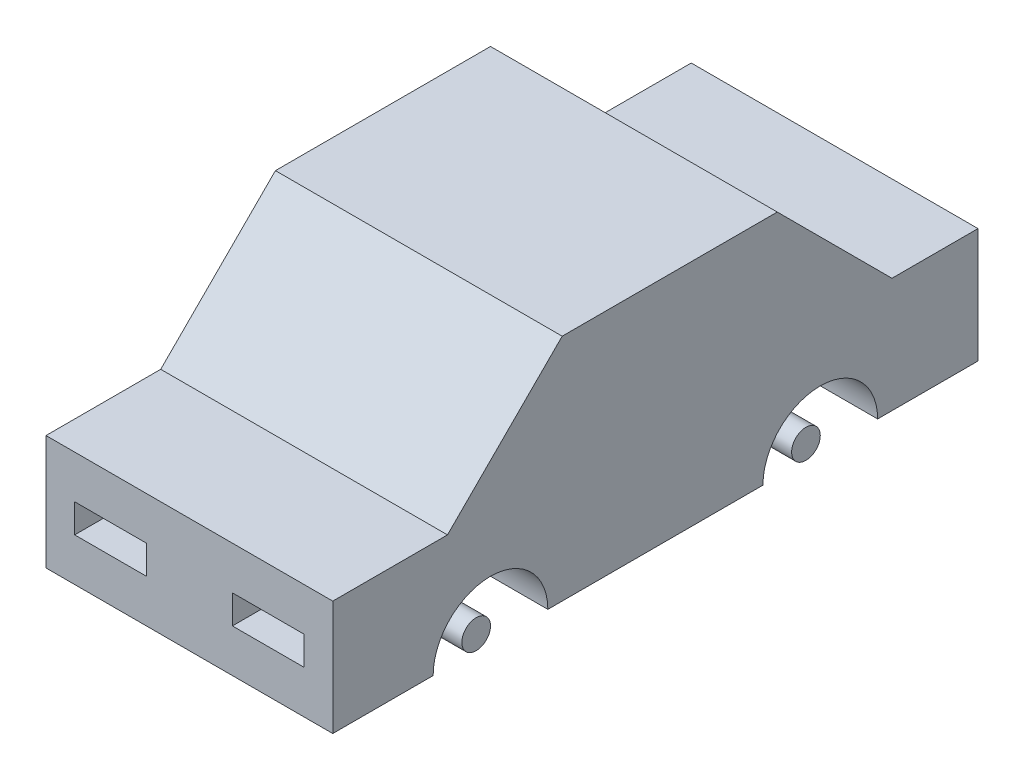
ISO-10303-21;
HEADER;
FILE_DESCRIPTION(('STEP AP214'),'2;1');
FILE_NAME('part.step','',(''),(''),'','','');
FILE_SCHEMA(('AUTOMOTIVE_DESIGN { 1 0 10303 214 1 1 1 1 }'));
ENDSEC;
DATA;
#1=APPLICATION_CONTEXT('core data for automotive mechanical design processes');
#2=APPLICATION_PROTOCOL_DEFINITION('international standard','automotive_design',2000,#1);
#3=PRODUCT_CONTEXT('',#1,'mechanical');
#4=PRODUCT('Part','Part','',(#3));
#5=PRODUCT_RELATED_PRODUCT_CATEGORY('part','',(#4));
#6=PRODUCT_DEFINITION_FORMATION('','',#4);
#7=PRODUCT_DEFINITION_CONTEXT('part definition',#1,'design');
#8=PRODUCT_DEFINITION('design','',#6,#7);
#9=PRODUCT_DEFINITION_SHAPE('','',#8);
#10=(LENGTH_UNIT() NAMED_UNIT(*) SI_UNIT(.MILLI.,.METRE.));
#11=(NAMED_UNIT(*) PLANE_ANGLE_UNIT() SI_UNIT($,.RADIAN.));
#12=(NAMED_UNIT(*) SI_UNIT($,.STERADIAN.) SOLID_ANGLE_UNIT());
#13=UNCERTAINTY_MEASURE_WITH_UNIT(LENGTH_MEASURE(1.E-05),#10,'distance_accuracy_value','');
#14=(GEOMETRIC_REPRESENTATION_CONTEXT(3) GLOBAL_UNCERTAINTY_ASSIGNED_CONTEXT((#13)) GLOBAL_UNIT_ASSIGNED_CONTEXT((#10,
#11,#12)) REPRESENTATION_CONTEXT('',''));
#15=CARTESIAN_POINT('',(0.,0.,0.));
#16=DIRECTION('',(0.,0.,1.));
#17=DIRECTION('',(1.,0.,0.));
#18=AXIS2_PLACEMENT_3D('',#15,#16,#17);
#19=CARTESIAN_POINT('',(1000.,0.,2250.));
#20=DIRECTION('',(0.,1.,0.));
#21=DIRECTION('',(0.,0.,1.));
#22=AXIS2_PLACEMENT_3D('',#19,#20,#21);
#23=PLANE('',#22);
#24=DIRECTION('',(-1.,0.,0.));
#25=VECTOR('',#24,1.);
#26=CARTESIAN_POINT('',(900.,0.,-1250.));
#27=LINE('',#26,#25);
#28=CARTESIAN_POINT('',(-600.,0.,-1250.));
#29=VERTEX_POINT('',#28);
#30=CARTESIAN_POINT('',(600.,0.,-1250.));
#31=VERTEX_POINT('',#30);
#32=EDGE_CURVE('E292',#29,#31,#27,.F.);
#33=ORIENTED_EDGE('',*,*,#32,.F.);
#34=DIRECTION('',(0.,0.,1.));
#35=VECTOR('',#34,1.);
#36=CARTESIAN_POINT('',(-600.,0.,-750.));
#37=LINE('',#36,#35);
#38=CARTESIAN_POINT('',(-600.,0.,-1550.));
#39=VERTEX_POINT('',#38);
#40=EDGE_CURVE('E315',#39,#29,#37,.T.);
#41=ORIENTED_EDGE('',*,*,#40,.F.);
#42=DIRECTION('',(-1.,0.,0.));
#43=VECTOR('',#42,1.);
#44=CARTESIAN_POINT('',(-600.,0.,-1550.));
#45=LINE('',#44,#43);
#46=CARTESIAN_POINT('',(-1000.,0.,-1550.));
#47=VERTEX_POINT('',#46);
#48=EDGE_CURVE('E318',#39,#47,#45,.T.);
#49=ORIENTED_EDGE('',*,*,#48,.T.);
#50=DIRECTION('',(0.,0.,-1.));
#51=VECTOR('',#50,1.);
#52=CARTESIAN_POINT('',(-1000.,0.,2250.));
#53=LINE('',#52,#51);
#54=CARTESIAN_POINT('',(-1000.,0.,-2250.));
#55=VERTEX_POINT('',#54);
#56=EDGE_CURVE('E351',#47,#55,#53,.T.);
#57=ORIENTED_EDGE('',*,*,#56,.T.);
#58=DIRECTION('',(-1.,0.,0.));
#59=VECTOR('',#58,1.);
#60=CARTESIAN_POINT('',(1000.,0.,-2250.));
#61=LINE('',#60,#59);
#62=CARTESIAN_POINT('',(1000.,0.,-2250.));
#63=VERTEX_POINT('',#62);
#64=EDGE_CURVE('E424',#63,#55,#61,.T.);
#65=ORIENTED_EDGE('',*,*,#64,.F.);
#66=DIRECTION('',(0.,0.,-1.));
#67=VECTOR('',#66,1.);
#68=CARTESIAN_POINT('',(1000.,0.,2250.));
#69=LINE('',#68,#67);
#70=CARTESIAN_POINT('',(1000.,0.,-1550.));
#71=VERTEX_POINT('',#70);
#72=EDGE_CURVE('E371',#71,#63,#69,.T.);
#73=ORIENTED_EDGE('',*,*,#72,.F.);
#74=DIRECTION('',(1.,0.,0.));
#75=VECTOR('',#74,1.);
#76=CARTESIAN_POINT('',(600.,0.,-1550.));
#77=LINE('',#76,#75);
#78=CARTESIAN_POINT('',(600.,0.,-1550.));
#79=VERTEX_POINT('',#78);
#80=EDGE_CURVE('E348',#79,#71,#77,.T.);
#81=ORIENTED_EDGE('',*,*,#80,.F.);
#82=DIRECTION('',(0.,0.,-1.));
#83=VECTOR('',#82,1.);
#84=CARTESIAN_POINT('',(600.,0.,-750.));
#85=LINE('',#84,#83);
#86=EDGE_CURVE('E357',#31,#79,#85,.T.);
#87=ORIENTED_EDGE('',*,*,#86,.F.);
#88=EDGE_LOOP('',(#33,#41,#49,#57,#65,#73,#81,#87));
#89=FACE_BOUND('',#88,.T.);
#90=ADVANCED_FACE('F32',(#89),#23,.F.);
#91=DIRECTION('',(-1.,0.,0.));
#92=VECTOR('',#91,1.);
#93=CARTESIAN_POINT('',(900.,0.,-1050.));
#94=LINE('',#93,#92);
#95=CARTESIAN_POINT('',(600.,0.,-1050.));
#96=VERTEX_POINT('',#95);
#97=CARTESIAN_POINT('',(-600.,0.,-1050.));
#98=VERTEX_POINT('',#97);
#99=EDGE_CURVE('E288',#96,#98,#94,.T.);
#100=ORIENTED_EDGE('',*,*,#99,.F.);
#101=CARTESIAN_POINT('',(600.,0.,-750.));
#102=VERTEX_POINT('',#101);
#103=EDGE_CURVE('E358',#102,#96,#85,.T.);
#104=ORIENTED_EDGE('',*,*,#103,.F.);
#105=DIRECTION('',(1.,0.,0.));
#106=VECTOR('',#105,1.);
#107=CARTESIAN_POINT('',(600.,0.,-750.));
#108=LINE('',#107,#106);
#109=CARTESIAN_POINT('',(1000.,0.,-750.));
#110=VERTEX_POINT('',#109);
#111=EDGE_CURVE('E361',#102,#110,#108,.T.);
#112=ORIENTED_EDGE('',*,*,#111,.T.);
#113=CARTESIAN_POINT('',(1000.,0.,750.));
#114=VERTEX_POINT('',#113);
#115=EDGE_CURVE('E370',#114,#110,#69,.T.);
#116=ORIENTED_EDGE('',*,*,#115,.F.);
#117=DIRECTION('',(1.,0.,0.));
#118=VECTOR('',#117,1.);
#119=CARTESIAN_POINT('',(600.,0.,750.));
#120=LINE('',#119,#118);
#121=CARTESIAN_POINT('',(600.,0.,750.));
#122=VERTEX_POINT('',#121);
#123=EDGE_CURVE('E349',#122,#114,#120,.T.);
#124=ORIENTED_EDGE('',*,*,#123,.F.);
#125=DIRECTION('',(0.,0.,-1.));
#126=VECTOR('',#125,1.);
#127=CARTESIAN_POINT('',(600.,0.,750.));
#128=LINE('',#127,#126);
#129=CARTESIAN_POINT('',(600.,0.,1050.));
#130=VERTEX_POINT('',#129);
#131=EDGE_CURVE('E341',#130,#122,#128,.T.);
#132=ORIENTED_EDGE('',*,*,#131,.F.);
#133=DIRECTION('',(-1.,0.,0.));
#134=VECTOR('',#133,1.);
#135=CARTESIAN_POINT('',(900.,0.,1050.));
#136=LINE('',#135,#134);
#137=CARTESIAN_POINT('',(-600.,0.,1050.));
#138=VERTEX_POINT('',#137);
#139=EDGE_CURVE('E305',#138,#130,#136,.F.);
#140=ORIENTED_EDGE('',*,*,#139,.F.);
#141=DIRECTION('',(0.,0.,1.));
#142=VECTOR('',#141,1.);
#143=CARTESIAN_POINT('',(-600.,0.,750.));
#144=LINE('',#143,#142);
#145=CARTESIAN_POINT('',(-600.,0.,750.));
#146=VERTEX_POINT('',#145);
#147=EDGE_CURVE('E330',#146,#138,#144,.T.);
#148=ORIENTED_EDGE('',*,*,#147,.F.);
#149=DIRECTION('',(-1.,0.,0.));
#150=VECTOR('',#149,1.);
#151=CARTESIAN_POINT('',(-600.,0.,750.));
#152=LINE('',#151,#150);
#153=CARTESIAN_POINT('',(-1000.,0.,750.));
#154=VERTEX_POINT('',#153);
#155=EDGE_CURVE('E333',#146,#154,#152,.T.);
#156=ORIENTED_EDGE('',*,*,#155,.T.);
#157=CARTESIAN_POINT('',(-1000.,0.,-750.));
#158=VERTEX_POINT('',#157);
#159=EDGE_CURVE('E390',#154,#158,#53,.T.);
#160=ORIENTED_EDGE('',*,*,#159,.T.);
#161=DIRECTION('',(-1.,0.,0.));
#162=VECTOR('',#161,1.);
#163=CARTESIAN_POINT('',(-600.,0.,-750.));
#164=LINE('',#163,#162);
#165=CARTESIAN_POINT('',(-600.,0.,-750.));
#166=VERTEX_POINT('',#165);
#167=EDGE_CURVE('E321',#166,#158,#164,.T.);
#168=ORIENTED_EDGE('',*,*,#167,.F.);
#169=EDGE_CURVE('E313',#98,#166,#37,.T.);
#170=ORIENTED_EDGE('',*,*,#169,.F.);
#171=EDGE_LOOP('',(#100,#104,#112,#116,#124,#132,#140,#148,#156,#160,#168,#170));
#172=FACE_BOUND('',#171,.T.);
#173=ADVANCED_FACE('F475',(#172),#23,.F.);
#174=DIRECTION('',(-1.,0.,0.));
#175=VECTOR('',#174,1.);
#176=CARTESIAN_POINT('',(900.,0.,1250.));
#177=LINE('',#176,#175);
#178=CARTESIAN_POINT('',(600.,0.,1250.));
#179=VERTEX_POINT('',#178);
#180=CARTESIAN_POINT('',(-600.,0.,1250.));
#181=VERTEX_POINT('',#180);
#182=EDGE_CURVE('E301',#179,#181,#177,.T.);
#183=ORIENTED_EDGE('',*,*,#182,.F.);
#184=CARTESIAN_POINT('',(600.,0.,1550.));
#185=VERTEX_POINT('',#184);
#186=EDGE_CURVE('E343',#185,#179,#128,.T.);
#187=ORIENTED_EDGE('',*,*,#186,.F.);
#188=DIRECTION('',(1.,0.,0.));
#189=VECTOR('',#188,1.);
#190=CARTESIAN_POINT('',(600.,0.,1550.));
#191=LINE('',#190,#189);
#192=CARTESIAN_POINT('',(1000.,0.,1550.));
#193=VERTEX_POINT('',#192);
#194=EDGE_CURVE('E346',#185,#193,#191,.T.);
#195=ORIENTED_EDGE('',*,*,#194,.T.);
#196=CARTESIAN_POINT('',(1000.,0.,2250.));
#197=VERTEX_POINT('',#196);
#198=EDGE_CURVE('E366',#197,#193,#69,.T.);
#199=ORIENTED_EDGE('',*,*,#198,.F.);
#200=DIRECTION('',(-1.,0.,0.));
#201=VECTOR('',#200,1.);
#202=CARTESIAN_POINT('',(1000.,0.,2250.));
#203=LINE('',#202,#201);
#204=CARTESIAN_POINT('',(-1000.,0.,2250.));
#205=VERTEX_POINT('',#204);
#206=EDGE_CURVE('E385',#197,#205,#203,.T.);
#207=ORIENTED_EDGE('',*,*,#206,.T.);
#208=CARTESIAN_POINT('',(-1000.,0.,1550.));
#209=VERTEX_POINT('',#208);
#210=EDGE_CURVE('E386',#205,#209,#53,.T.);
#211=ORIENTED_EDGE('',*,*,#210,.T.);
#212=DIRECTION('',(-1.,0.,0.));
#213=VECTOR('',#212,1.);
#214=CARTESIAN_POINT('',(-600.,0.,1550.));
#215=LINE('',#214,#213);
#216=CARTESIAN_POINT('',(-600.,0.,1550.));
#217=VERTEX_POINT('',#216);
#218=EDGE_CURVE('E320',#217,#209,#215,.T.);
#219=ORIENTED_EDGE('',*,*,#218,.F.);
#220=EDGE_CURVE('E329',#181,#217,#144,.T.);
#221=ORIENTED_EDGE('',*,*,#220,.F.);
#222=EDGE_LOOP('',(#183,#187,#195,#199,#207,#211,#219,#221));
#223=FACE_BOUND('',#222,.T.);
#224=ADVANCED_FACE('F437',(#223),#23,.F.);
#225=CARTESIAN_POINT('',(1000.,0.,-2250.));
#226=DIRECTION('',(0.,0.,1.));
#227=DIRECTION('',(1.,0.,0.));
#228=AXIS2_PLACEMENT_3D('',#225,#226,#227);
#229=PLANE('',#228);
#230=DIRECTION('',(0.,1.,0.));
#231=VECTOR('',#230,1.);
#232=CARTESIAN_POINT('',(-1000.,0.,-2250.));
#233=LINE('',#232,#231);
#234=CARTESIAN_POINT('',(-1000.,800.,-2250.));
#235=VERTEX_POINT('',#234);
#236=EDGE_CURVE('E389',#55,#235,#233,.T.);
#237=ORIENTED_EDGE('',*,*,#236,.T.);
#238=DIRECTION('',(-1.,0.,0.));
#239=VECTOR('',#238,1.);
#240=CARTESIAN_POINT('',(1000.,800.,-2250.));
#241=LINE('',#240,#239);
#242=CARTESIAN_POINT('',(1000.,800.,-2250.));
#243=VERTEX_POINT('',#242);
#244=EDGE_CURVE('E421',#243,#235,#241,.T.);
#245=ORIENTED_EDGE('',*,*,#244,.F.);
#246=DIRECTION('',(0.,1.,0.));
#247=VECTOR('',#246,1.);
#248=CARTESIAN_POINT('',(1000.,0.,-2250.));
#249=LINE('',#248,#247);
#250=EDGE_CURVE('E369',#63,#243,#249,.T.);
#251=ORIENTED_EDGE('',*,*,#250,.F.);
#252=ORIENTED_EDGE('',*,*,#64,.T.);
#253=EDGE_LOOP('',(#237,#245,#251,#252));
#254=FACE_BOUND('',#253,.T.);
#255=ADVANCED_FACE('F463',(#254),#229,.F.);
#256=CARTESIAN_POINT('',(1000.,800.,-2250.));
#257=DIRECTION('',(0.,-1.,0.));
#258=DIRECTION('',(0.,0.,-1.));
#259=AXIS2_PLACEMENT_3D('',#256,#257,#258);
#260=PLANE('',#259);
#261=DIRECTION('',(0.,0.,1.));
#262=VECTOR('',#261,1.);
#263=CARTESIAN_POINT('',(-1000.,800.,-2250.));
#264=LINE('',#263,#262);
#265=CARTESIAN_POINT('',(-1000.,800.,-1650.));
#266=VERTEX_POINT('',#265);
#267=EDGE_CURVE('E392',#235,#266,#264,.T.);
#268=ORIENTED_EDGE('',*,*,#267,.T.);
#269=DIRECTION('',(-1.,0.,0.));
#270=VECTOR('',#269,1.);
#271=CARTESIAN_POINT('',(1000.,800.,-1650.));
#272=LINE('',#271,#270);
#273=CARTESIAN_POINT('',(1000.,800.,-1650.));
#274=VERTEX_POINT('',#273);
#275=EDGE_CURVE('E418',#274,#266,#272,.T.);
#276=ORIENTED_EDGE('',*,*,#275,.F.);
#277=DIRECTION('',(0.,0.,1.));
#278=VECTOR('',#277,1.);
#279=CARTESIAN_POINT('',(1000.,800.,-2250.));
#280=LINE('',#279,#278);
#281=EDGE_CURVE('E373',#243,#274,#280,.T.);
#282=ORIENTED_EDGE('',*,*,#281,.F.);
#283=ORIENTED_EDGE('',*,*,#244,.T.);
#284=EDGE_LOOP('',(#268,#276,#282,#283));
#285=FACE_BOUND('',#284,.T.);
#286=ADVANCED_FACE('F521',(#285),#260,.F.);
#287=CARTESIAN_POINT('',(1000.,800.,-1650.));
#288=DIRECTION('',(0.,-0.707106781186547,0.707106781186548));
#289=DIRECTION('',(0.,-0.707106781186548,-0.707106781186547));
#290=AXIS2_PLACEMENT_3D('',#287,#288,#289);
#291=PLANE('',#290);
#292=DIRECTION('',(0.,0.707106781186548,0.707106781186547));
#293=VECTOR('',#292,1.);
#294=CARTESIAN_POINT('',(-1000.,800.,-1650.));
#295=LINE('',#294,#293);
#296=CARTESIAN_POINT('',(-1000.,1600.,-850.));
#297=VERTEX_POINT('',#296);
#298=EDGE_CURVE('E394',#266,#297,#295,.T.);
#299=ORIENTED_EDGE('',*,*,#298,.T.);
#300=DIRECTION('',(-1.,0.,0.));
#301=VECTOR('',#300,1.);
#302=CARTESIAN_POINT('',(1000.,1600.,-850.));
#303=LINE('',#302,#301);
#304=CARTESIAN_POINT('',(1000.,1600.,-850.));
#305=VERTEX_POINT('',#304);
#306=EDGE_CURVE('E415',#305,#297,#303,.T.);
#307=ORIENTED_EDGE('',*,*,#306,.F.);
#308=DIRECTION('',(0.,0.707106781186548,0.707106781186547));
#309=VECTOR('',#308,1.);
#310=CARTESIAN_POINT('',(1000.,800.,-1650.));
#311=LINE('',#310,#309);
#312=EDGE_CURVE('E375',#274,#305,#311,.T.);
#313=ORIENTED_EDGE('',*,*,#312,.F.);
#314=ORIENTED_EDGE('',*,*,#275,.T.);
#315=EDGE_LOOP('',(#299,#307,#313,#314));
#316=FACE_BOUND('',#315,.T.);
#317=ADVANCED_FACE('F525',(#316),#291,.F.);
#318=CARTESIAN_POINT('',(1000.,1600.,-850.));
#319=DIRECTION('',(0.,-1.,0.));
#320=DIRECTION('',(0.,0.,-1.));
#321=AXIS2_PLACEMENT_3D('',#318,#319,#320);
#322=PLANE('',#321);
#323=DIRECTION('',(0.,0.,1.));
#324=VECTOR('',#323,1.);
#325=CARTESIAN_POINT('',(-1000.,1600.,-850.));
#326=LINE('',#325,#324);
#327=CARTESIAN_POINT('',(-1000.,1600.,650.));
#328=VERTEX_POINT('',#327);
#329=EDGE_CURVE('E396',#297,#328,#326,.T.);
#330=ORIENTED_EDGE('',*,*,#329,.T.);
#331=DIRECTION('',(-1.,0.,0.));
#332=VECTOR('',#331,1.);
#333=CARTESIAN_POINT('',(1000.,1600.,650.));
#334=LINE('',#333,#332);
#335=CARTESIAN_POINT('',(1000.,1600.,650.));
#336=VERTEX_POINT('',#335);
#337=EDGE_CURVE('E412',#336,#328,#334,.T.);
#338=ORIENTED_EDGE('',*,*,#337,.F.);
#339=DIRECTION('',(0.,0.,1.));
#340=VECTOR('',#339,1.);
#341=CARTESIAN_POINT('',(1000.,1600.,-850.));
#342=LINE('',#341,#340);
#343=EDGE_CURVE('E377',#305,#336,#342,.T.);
#344=ORIENTED_EDGE('',*,*,#343,.F.);
#345=ORIENTED_EDGE('',*,*,#306,.T.);
#346=EDGE_LOOP('',(#330,#338,#344,#345));
#347=FACE_BOUND('',#346,.T.);
#348=ADVANCED_FACE('F531',(#347),#322,.F.);
#349=CARTESIAN_POINT('',(1000.,1600.,650.));
#350=DIRECTION('',(0.,-0.707106781186548,-0.707106781186547));
#351=DIRECTION('',(0.,0.707106781186547,-0.707106781186548));
#352=AXIS2_PLACEMENT_3D('',#349,#350,#351);
#353=PLANE('',#352);
#354=DIRECTION('',(0.,-0.707106781186547,0.707106781186548));
#355=VECTOR('',#354,1.);
#356=CARTESIAN_POINT('',(-1000.,1600.,650.));
#357=LINE('',#356,#355);
#358=CARTESIAN_POINT('',(-1000.,800.,1450.));
#359=VERTEX_POINT('',#358);
#360=EDGE_CURVE('E398',#328,#359,#357,.T.);
#361=ORIENTED_EDGE('',*,*,#360,.T.);
#362=DIRECTION('',(-1.,0.,0.));
#363=VECTOR('',#362,1.);
#364=CARTESIAN_POINT('',(1000.,800.,1450.));
#365=LINE('',#364,#363);
#366=CARTESIAN_POINT('',(1000.,800.,1450.));
#367=VERTEX_POINT('',#366);
#368=EDGE_CURVE('E409',#367,#359,#365,.T.);
#369=ORIENTED_EDGE('',*,*,#368,.F.);
#370=DIRECTION('',(0.,-0.707106781186547,0.707106781186548));
#371=VECTOR('',#370,1.);
#372=CARTESIAN_POINT('',(1000.,1600.,650.));
#373=LINE('',#372,#371);
#374=EDGE_CURVE('E379',#336,#367,#373,.T.);
#375=ORIENTED_EDGE('',*,*,#374,.F.);
#376=ORIENTED_EDGE('',*,*,#337,.T.);
#377=EDGE_LOOP('',(#361,#369,#375,#376));
#378=FACE_BOUND('',#377,.T.);
#379=ADVANCED_FACE('F535',(#378),#353,.F.);
#380=CARTESIAN_POINT('',(1000.,800.,1450.));
#381=DIRECTION('',(0.,-1.,0.));
#382=DIRECTION('',(0.,0.,-1.));
#383=AXIS2_PLACEMENT_3D('',#380,#381,#382);
#384=PLANE('',#383);
#385=DIRECTION('',(0.,0.,1.));
#386=VECTOR('',#385,1.);
#387=CARTESIAN_POINT('',(-1000.,800.,1450.));
#388=LINE('',#387,#386);
#389=CARTESIAN_POINT('',(-1000.,800.,2250.));
#390=VERTEX_POINT('',#389);
#391=EDGE_CURVE('E400',#359,#390,#388,.T.);
#392=ORIENTED_EDGE('',*,*,#391,.T.);
#393=DIRECTION('',(-1.,0.,0.));
#394=VECTOR('',#393,1.);
#395=CARTESIAN_POINT('',(1000.,800.,2250.));
#396=LINE('',#395,#394);
#397=CARTESIAN_POINT('',(1000.,800.,2250.));
#398=VERTEX_POINT('',#397);
#399=EDGE_CURVE('E406',#398,#390,#396,.T.);
#400=ORIENTED_EDGE('',*,*,#399,.F.);
#401=DIRECTION('',(0.,0.,1.));
#402=VECTOR('',#401,1.);
#403=CARTESIAN_POINT('',(1000.,800.,1450.));
#404=LINE('',#403,#402);
#405=EDGE_CURVE('E381',#367,#398,#404,.T.);
#406=ORIENTED_EDGE('',*,*,#405,.F.);
#407=ORIENTED_EDGE('',*,*,#368,.T.);
#408=EDGE_LOOP('',(#392,#400,#406,#407));
#409=FACE_BOUND('',#408,.T.);
#410=ADVANCED_FACE('F539',(#409),#384,.F.);
#411=CARTESIAN_POINT('',(1000.,800.,2250.));
#412=DIRECTION('',(0.,0.,-1.));
#413=DIRECTION('',(-1.,0.,0.));
#414=AXIS2_PLACEMENT_3D('',#411,#412,#413);
#415=PLANE('',#414);
#416=DIRECTION('',(1.,0.,0.));
#417=VECTOR('',#416,1.);
#418=CARTESIAN_POINT('',(-800.,300.,2250.));
#419=LINE('',#418,#417);
#420=CARTESIAN_POINT('',(-800.,300.,2250.));
#421=VERTEX_POINT('',#420);
#422=CARTESIAN_POINT('',(-300.,300.,2250.));
#423=VERTEX_POINT('',#422);
#424=EDGE_CURVE('E245',#421,#423,#419,.T.);
#425=ORIENTED_EDGE('',*,*,#424,.F.);
#426=DIRECTION('',(0.,-1.,0.));
#427=VECTOR('',#426,1.);
#428=CARTESIAN_POINT('',(-800.,500.,2250.));
#429=LINE('',#428,#427);
#430=CARTESIAN_POINT('',(-800.,500.,2250.));
#431=VERTEX_POINT('',#430);
#432=EDGE_CURVE('E46',#431,#421,#429,.T.);
#433=ORIENTED_EDGE('',*,*,#432,.F.);
#434=DIRECTION('',(-1.,0.,0.));
#435=VECTOR('',#434,1.);
#436=CARTESIAN_POINT('',(-800.,500.,2250.));
#437=LINE('',#436,#435);
#438=CARTESIAN_POINT('',(-300.,500.,2250.));
#439=VERTEX_POINT('',#438);
#440=EDGE_CURVE('E236',#439,#431,#437,.T.);
#441=ORIENTED_EDGE('',*,*,#440,.F.);
#442=DIRECTION('',(0.,1.,0.));
#443=VECTOR('',#442,1.);
#444=CARTESIAN_POINT('',(-300.,500.,2250.));
#445=LINE('',#444,#443);
#446=EDGE_CURVE('E239',#423,#439,#445,.T.);
#447=ORIENTED_EDGE('',*,*,#446,.F.);
#448=EDGE_LOOP('',(#425,#433,#441,#447));
#449=FACE_BOUND('',#448,.T.);
#450=DIRECTION('',(-1.,0.,0.));
#451=VECTOR('',#450,1.);
#452=CARTESIAN_POINT('',(800.,500.,2250.));
#453=LINE('',#452,#451);
#454=CARTESIAN_POINT('',(800.,500.,2250.));
#455=VERTEX_POINT('',#454);
#456=CARTESIAN_POINT('',(300.,500.,2250.));
#457=VERTEX_POINT('',#456);
#458=EDGE_CURVE('E271',#455,#457,#453,.T.);
#459=ORIENTED_EDGE('',*,*,#458,.F.);
#460=DIRECTION('',(0.,1.,0.));
#461=VECTOR('',#460,1.);
#462=CARTESIAN_POINT('',(800.,500.,2250.));
#463=LINE('',#462,#461);
#464=CARTESIAN_POINT('',(800.,300.,2250.));
#465=VERTEX_POINT('',#464);
#466=EDGE_CURVE('E54',#465,#455,#463,.T.);
#467=ORIENTED_EDGE('',*,*,#466,.F.);
#468=DIRECTION('',(1.,0.,0.));
#469=VECTOR('',#468,1.);
#470=CARTESIAN_POINT('',(800.,300.,2250.));
#471=LINE('',#470,#469);
#472=CARTESIAN_POINT('',(300.,300.,2250.));
#473=VERTEX_POINT('',#472);
#474=EDGE_CURVE('E260',#473,#465,#471,.T.);
#475=ORIENTED_EDGE('',*,*,#474,.F.);
#476=DIRECTION('',(0.,-1.,0.));
#477=VECTOR('',#476,1.);
#478=CARTESIAN_POINT('',(300.,500.,2250.));
#479=LINE('',#478,#477);
#480=EDGE_CURVE('E274',#457,#473,#479,.T.);
#481=ORIENTED_EDGE('',*,*,#480,.F.);
#482=EDGE_LOOP('',(#459,#467,#475,#481));
#483=FACE_BOUND('',#482,.T.);
#484=DIRECTION('',(0.,-1.,0.));
#485=VECTOR('',#484,1.);
#486=CARTESIAN_POINT('',(-1000.,800.,2250.));
#487=LINE('',#486,#485);
#488=EDGE_CURVE('E402',#390,#205,#487,.T.);
#489=ORIENTED_EDGE('',*,*,#488,.T.);
#490=ORIENTED_EDGE('',*,*,#206,.F.);
#491=DIRECTION('',(0.,-1.,0.));
#492=VECTOR('',#491,1.);
#493=CARTESIAN_POINT('',(1000.,800.,2250.));
#494=LINE('',#493,#492);
#495=EDGE_CURVE('E383',#398,#197,#494,.T.);
#496=ORIENTED_EDGE('',*,*,#495,.F.);
#497=ORIENTED_EDGE('',*,*,#399,.T.);
#498=EDGE_LOOP('',(#489,#490,#496,#497));
#499=FACE_BOUND('',#498,.T.);
#500=ADVANCED_FACE('F543',(#449,#483,#499),#415,.F.);
#501=CARTESIAN_POINT('',(1000.,0.,0.));
#502=DIRECTION('',(1.,0.,0.));
#503=DIRECTION('',(0.,0.,-1.));
#504=AXIS2_PLACEMENT_3D('',#501,#502,#503);
#505=PLANE('',#504);
#506=CARTESIAN_POINT('',(1000.,0.,1150.));
#507=DIRECTION('',(1.,0.,0.));
#508=DIRECTION('',(0.,0.,1.));
#509=AXIS2_PLACEMENT_3D('',#506,#507,#508);
#510=CIRCLE('',#509,400.);
#511=EDGE_CURVE('E342',#114,#193,#510,.T.);
#512=ORIENTED_EDGE('',*,*,#511,.F.);
#513=ORIENTED_EDGE('',*,*,#115,.T.);
#514=CARTESIAN_POINT('',(1000.,0.,-1150.));
#515=DIRECTION('',(1.,0.,0.));
#516=DIRECTION('',(0.,0.,-1.));
#517=AXIS2_PLACEMENT_3D('',#514,#515,#516);
#518=CIRCLE('',#517,400.);
#519=EDGE_CURVE('E323',#71,#110,#518,.T.);
#520=ORIENTED_EDGE('',*,*,#519,.F.);
#521=ORIENTED_EDGE('',*,*,#72,.T.);
#522=ORIENTED_EDGE('',*,*,#250,.T.);
#523=ORIENTED_EDGE('',*,*,#281,.T.);
#524=ORIENTED_EDGE('',*,*,#312,.T.);
#525=ORIENTED_EDGE('',*,*,#343,.T.);
#526=ORIENTED_EDGE('',*,*,#374,.T.);
#527=ORIENTED_EDGE('',*,*,#405,.T.);
#528=ORIENTED_EDGE('',*,*,#495,.T.);
#529=ORIENTED_EDGE('',*,*,#198,.T.);
#530=EDGE_LOOP('',(#512,#513,#520,#521,#522,#523,#524,#525,#526,#527,#528,#529));
#531=FACE_BOUND('',#530,.T.);
#532=ADVANCED_FACE('F467',(#531),#505,.T.);
#533=CARTESIAN_POINT('',(-1000.,0.,0.));
#534=DIRECTION('',(1.,0.,0.));
#535=DIRECTION('',(0.,0.,-1.));
#536=AXIS2_PLACEMENT_3D('',#533,#534,#535);
#537=PLANE('',#536);
#538=ORIENTED_EDGE('',*,*,#56,.F.);
#539=CARTESIAN_POINT('',(-1000.,0.,-1150.));
#540=DIRECTION('',(-1.,0.,0.));
#541=DIRECTION('',(0.,0.,1.));
#542=AXIS2_PLACEMENT_3D('',#539,#540,#541);
#543=CIRCLE('',#542,400.);
#544=EDGE_CURVE('E314',#158,#47,#543,.T.);
#545=ORIENTED_EDGE('',*,*,#544,.F.);
#546=ORIENTED_EDGE('',*,*,#159,.F.);
#547=CARTESIAN_POINT('',(-1000.,0.,1150.));
#548=DIRECTION('',(-1.,0.,0.));
#549=DIRECTION('',(0.,0.,1.));
#550=AXIS2_PLACEMENT_3D('',#547,#548,#549);
#551=CIRCLE('',#550,400.);
#552=EDGE_CURVE('E309',#209,#154,#551,.T.);
#553=ORIENTED_EDGE('',*,*,#552,.F.);
#554=ORIENTED_EDGE('',*,*,#210,.F.);
#555=ORIENTED_EDGE('',*,*,#488,.F.);
#556=ORIENTED_EDGE('',*,*,#391,.F.);
#557=ORIENTED_EDGE('',*,*,#360,.F.);
#558=ORIENTED_EDGE('',*,*,#329,.F.);
#559=ORIENTED_EDGE('',*,*,#298,.F.);
#560=ORIENTED_EDGE('',*,*,#267,.F.);
#561=ORIENTED_EDGE('',*,*,#236,.F.);
#562=EDGE_LOOP('',(#538,#545,#546,#553,#554,#555,#556,#557,#558,#559,#560,#561));
#563=FACE_BOUND('',#562,.T.);
#564=ADVANCED_FACE('F446',(#563),#537,.F.);
#565=CARTESIAN_POINT('',(600.,0.,-1150.));
#566=DIRECTION('',(1.,0.,0.));
#567=DIRECTION('',(0.,0.,-1.));
#568=AXIS2_PLACEMENT_3D('',#565,#566,#567);
#569=CYLINDRICAL_SURFACE('',#568,400.);
#570=ORIENTED_EDGE('',*,*,#519,.T.);
#571=ORIENTED_EDGE('',*,*,#111,.F.);
#572=CARTESIAN_POINT('',(600.,0.,-1150.));
#573=DIRECTION('',(1.,0.,0.));
#574=DIRECTION('',(0.,0.,-1.));
#575=AXIS2_PLACEMENT_3D('',#572,#573,#574);
#576=CIRCLE('',#575,400.);
#577=EDGE_CURVE('E354',#79,#102,#576,.T.);
#578=ORIENTED_EDGE('',*,*,#577,.F.);
#579=ORIENTED_EDGE('',*,*,#80,.T.);
#580=EDGE_LOOP('',(#570,#571,#578,#579));
#581=FACE_BOUND('',#580,.T.);
#582=ADVANCED_FACE('F480',(#581),#569,.F.);
#583=CARTESIAN_POINT('',(600.,0.,-1150.));
#584=DIRECTION('',(1.,0.,0.));
#585=DIRECTION('',(0.,0.,-1.));
#586=AXIS2_PLACEMENT_3D('',#583,#584,#585);
#587=PLANE('',#586);
#588=ORIENTED_EDGE('',*,*,#103,.T.);
#589=CARTESIAN_POINT('',(600.,0.,-1150.));
#590=DIRECTION('',(1.,0.,0.));
#591=DIRECTION('',(0.,0.,-1.));
#592=AXIS2_PLACEMENT_3D('',#589,#590,#591);
#593=CIRCLE('',#592,100.);
#594=EDGE_CURVE('E294',#96,#31,#593,.F.);
#595=ORIENTED_EDGE('',*,*,#594,.T.);
#596=ORIENTED_EDGE('',*,*,#86,.T.);
#597=ORIENTED_EDGE('',*,*,#577,.T.);
#598=EDGE_LOOP('',(#588,#595,#596,#597));
#599=FACE_BOUND('',#598,.T.);
#600=ADVANCED_FACE('F482',(#599),#587,.T.);
#601=CARTESIAN_POINT('',(600.,0.,1150.));
#602=DIRECTION('',(1.,0.,0.));
#603=DIRECTION('',(0.,0.,-1.));
#604=AXIS2_PLACEMENT_3D('',#601,#602,#603);
#605=CYLINDRICAL_SURFACE('',#604,400.);
#606=ORIENTED_EDGE('',*,*,#511,.T.);
#607=ORIENTED_EDGE('',*,*,#194,.F.);
#608=CARTESIAN_POINT('',(600.,0.,1150.));
#609=DIRECTION('',(1.,0.,0.));
#610=DIRECTION('',(0.,0.,1.));
#611=AXIS2_PLACEMENT_3D('',#608,#609,#610);
#612=CIRCLE('',#611,400.);
#613=EDGE_CURVE('E338',#122,#185,#612,.T.);
#614=ORIENTED_EDGE('',*,*,#613,.F.);
#615=ORIENTED_EDGE('',*,*,#123,.T.);
#616=EDGE_LOOP('',(#606,#607,#614,#615));
#617=FACE_BOUND('',#616,.T.);
#618=ADVANCED_FACE('F556',(#617),#605,.F.);
#619=CARTESIAN_POINT('',(600.,0.,1150.));
#620=DIRECTION('',(-1.,0.,0.));
#621=DIRECTION('',(0.,0.,1.));
#622=AXIS2_PLACEMENT_3D('',#619,#620,#621);
#623=PLANE('',#622);
#624=CARTESIAN_POINT('',(600.,0.,1150.));
#625=DIRECTION('',(-1.,0.,0.));
#626=DIRECTION('',(0.,0.,1.));
#627=AXIS2_PLACEMENT_3D('',#624,#625,#626);
#628=CIRCLE('',#627,100.);
#629=EDGE_CURVE('E307',#130,#179,#628,.F.);
#630=ORIENTED_EDGE('',*,*,#629,.F.);
#631=ORIENTED_EDGE('',*,*,#131,.T.);
#632=ORIENTED_EDGE('',*,*,#613,.T.);
#633=ORIENTED_EDGE('',*,*,#186,.T.);
#634=EDGE_LOOP('',(#630,#631,#632,#633));
#635=FACE_BOUND('',#634,.T.);
#636=ADVANCED_FACE('F559',(#635),#623,.F.);
#637=CARTESIAN_POINT('',(-600.,0.,1150.));
#638=DIRECTION('',(-1.,0.,0.));
#639=DIRECTION('',(0.,0.,1.));
#640=AXIS2_PLACEMENT_3D('',#637,#638,#639);
#641=CYLINDRICAL_SURFACE('',#640,400.);
#642=ORIENTED_EDGE('',*,*,#552,.T.);
#643=ORIENTED_EDGE('',*,*,#155,.F.);
#644=CARTESIAN_POINT('',(-600.,0.,1150.));
#645=DIRECTION('',(-1.,0.,0.));
#646=DIRECTION('',(0.,0.,1.));
#647=AXIS2_PLACEMENT_3D('',#644,#645,#646);
#648=CIRCLE('',#647,400.);
#649=EDGE_CURVE('E326',#217,#146,#648,.T.);
#650=ORIENTED_EDGE('',*,*,#649,.F.);
#651=ORIENTED_EDGE('',*,*,#218,.T.);
#652=EDGE_LOOP('',(#642,#643,#650,#651));
#653=FACE_BOUND('',#652,.T.);
#654=ADVANCED_FACE('F442',(#653),#641,.F.);
#655=CARTESIAN_POINT('',(-600.,0.,1150.));
#656=DIRECTION('',(-1.,0.,0.));
#657=DIRECTION('',(0.,0.,1.));
#658=AXIS2_PLACEMENT_3D('',#655,#656,#657);
#659=PLANE('',#658);
#660=ORIENTED_EDGE('',*,*,#147,.T.);
#661=CARTESIAN_POINT('',(-600.,0.,1150.));
#662=DIRECTION('',(-1.,0.,0.));
#663=DIRECTION('',(0.,0.,1.));
#664=AXIS2_PLACEMENT_3D('',#661,#662,#663);
#665=CIRCLE('',#664,100.);
#666=EDGE_CURVE('E39',#138,#181,#665,.F.);
#667=ORIENTED_EDGE('',*,*,#666,.T.);
#668=ORIENTED_EDGE('',*,*,#220,.T.);
#669=ORIENTED_EDGE('',*,*,#649,.T.);
#670=EDGE_LOOP('',(#660,#667,#668,#669));
#671=FACE_BOUND('',#670,.T.);
#672=ADVANCED_FACE('F429',(#671),#659,.T.);
#673=CARTESIAN_POINT('',(-600.,0.,-1150.));
#674=DIRECTION('',(-1.,0.,0.));
#675=DIRECTION('',(0.,0.,1.));
#676=AXIS2_PLACEMENT_3D('',#673,#674,#675);
#677=CYLINDRICAL_SURFACE('',#676,400.);
#678=ORIENTED_EDGE('',*,*,#544,.T.);
#679=ORIENTED_EDGE('',*,*,#48,.F.);
#680=CARTESIAN_POINT('',(-600.,0.,-1150.));
#681=DIRECTION('',(-1.,0.,0.));
#682=DIRECTION('',(0.,0.,1.));
#683=AXIS2_PLACEMENT_3D('',#680,#681,#682);
#684=CIRCLE('',#683,400.);
#685=EDGE_CURVE('E310',#166,#39,#684,.T.);
#686=ORIENTED_EDGE('',*,*,#685,.F.);
#687=ORIENTED_EDGE('',*,*,#167,.T.);
#688=EDGE_LOOP('',(#678,#679,#686,#687));
#689=FACE_BOUND('',#688,.T.);
#690=ADVANCED_FACE('F490',(#689),#677,.F.);
#691=CARTESIAN_POINT('',(-600.,0.,-1150.));
#692=DIRECTION('',(-1.,0.,0.));
#693=DIRECTION('',(0.,0.,1.));
#694=AXIS2_PLACEMENT_3D('',#691,#692,#693);
#695=PLANE('',#694);
#696=ORIENTED_EDGE('',*,*,#40,.T.);
#697=CARTESIAN_POINT('',(-600.,0.,-1150.));
#698=DIRECTION('',(-1.,0.,0.));
#699=DIRECTION('',(0.,0.,1.));
#700=AXIS2_PLACEMENT_3D('',#697,#698,#699);
#701=CIRCLE('',#700,100.);
#702=EDGE_CURVE('E11',#29,#98,#701,.F.);
#703=ORIENTED_EDGE('',*,*,#702,.T.);
#704=ORIENTED_EDGE('',*,*,#169,.T.);
#705=ORIENTED_EDGE('',*,*,#685,.T.);
#706=EDGE_LOOP('',(#696,#703,#704,#705));
#707=FACE_BOUND('',#706,.T.);
#708=ADVANCED_FACE('F486',(#707),#695,.T.);
#709=CARTESIAN_POINT('',(900.,0.,1150.));
#710=DIRECTION('',(-1.,0.,0.));
#711=DIRECTION('',(0.,0.,1.));
#712=AXIS2_PLACEMENT_3D('',#709,#710,#711);
#713=CYLINDRICAL_SURFACE('',#712,100.);
#714=CARTESIAN_POINT('',(900.,0.,1150.));
#715=DIRECTION('',(1.,0.,0.));
#716=DIRECTION('',(0.,0.,-1.));
#717=AXIS2_PLACEMENT_3D('',#714,#715,#716);
#718=CIRCLE('',#717,100.);
#719=CARTESIAN_POINT('',(900.,0.,1050.));
#720=VERTEX_POINT('',#719);
#721=EDGE_CURVE('E298',#720,#720,#718,.T.);
#722=ORIENTED_EDGE('',*,*,#721,.F.);
#723=EDGE_LOOP('',(#722));
#724=FACE_BOUND('',#723,.T.);
#725=CARTESIAN_POINT('',(-900.,0.,1150.));
#726=DIRECTION('',(1.,0.,0.));
#727=DIRECTION('',(0.,0.,-1.));
#728=AXIS2_PLACEMENT_3D('',#725,#726,#727);
#729=CIRCLE('',#728,100.);
#730=CARTESIAN_POINT('',(-900.,0.,1050.));
#731=VERTEX_POINT('',#730);
#732=EDGE_CURVE('E297',#731,#731,#729,.T.);
#733=ORIENTED_EDGE('',*,*,#732,.T.);
#734=EDGE_LOOP('',(#733));
#735=FACE_BOUND('',#734,.T.);
#736=ORIENTED_EDGE('',*,*,#139,.T.);
#737=ORIENTED_EDGE('',*,*,#629,.T.);
#738=ORIENTED_EDGE('',*,*,#182,.T.);
#739=ORIENTED_EDGE('',*,*,#666,.F.);
#740=EDGE_LOOP('',(#736,#737,#738,#739));
#741=FACE_BOUND('',#740,.T.);
#742=ADVANCED_FACE('F572',(#724,#735,#741),#713,.T.);
#743=CARTESIAN_POINT('',(900.,0.,1150.));
#744=DIRECTION('',(1.,0.,0.));
#745=DIRECTION('',(0.,0.,-1.));
#746=AXIS2_PLACEMENT_3D('',#743,#744,#745);
#747=PLANE('',#746);
#748=ORIENTED_EDGE('',*,*,#721,.T.);
#749=EDGE_LOOP('',(#748));
#750=FACE_BOUND('',#749,.T.);
#751=ADVANCED_FACE('F575',(#750),#747,.T.);
#752=CARTESIAN_POINT('',(-900.,0.,1150.));
#753=DIRECTION('',(1.,0.,0.));
#754=DIRECTION('',(0.,0.,-1.));
#755=AXIS2_PLACEMENT_3D('',#752,#753,#754);
#756=PLANE('',#755);
#757=ORIENTED_EDGE('',*,*,#732,.F.);
#758=EDGE_LOOP('',(#757));
#759=FACE_BOUND('',#758,.T.);
#760=ADVANCED_FACE('F495',(#759),#756,.F.);
#761=CARTESIAN_POINT('',(900.,0.,-1150.));
#762=DIRECTION('',(-1.,0.,0.));
#763=DIRECTION('',(0.,0.,1.));
#764=AXIS2_PLACEMENT_3D('',#761,#762,#763);
#765=CYLINDRICAL_SURFACE('',#764,100.);
#766=ORIENTED_EDGE('',*,*,#594,.F.);
#767=ORIENTED_EDGE('',*,*,#99,.T.);
#768=ORIENTED_EDGE('',*,*,#702,.F.);
#769=ORIENTED_EDGE('',*,*,#32,.T.);
#770=EDGE_LOOP('',(#766,#767,#768,#769));
#771=FACE_BOUND('',#770,.T.);
#772=CARTESIAN_POINT('',(900.,0.,-1150.));
#773=DIRECTION('',(1.,0.,0.));
#774=DIRECTION('',(0.,0.,-1.));
#775=AXIS2_PLACEMENT_3D('',#772,#773,#774);
#776=CIRCLE('',#775,100.);
#777=CARTESIAN_POINT('',(900.,0.,-1250.));
#778=VERTEX_POINT('',#777);
#779=EDGE_CURVE('E285',#778,#778,#776,.T.);
#780=ORIENTED_EDGE('',*,*,#779,.F.);
#781=EDGE_LOOP('',(#780));
#782=FACE_BOUND('',#781,.T.);
#783=CARTESIAN_POINT('',(-900.,0.,-1150.));
#784=DIRECTION('',(1.,0.,0.));
#785=DIRECTION('',(0.,0.,-1.));
#786=AXIS2_PLACEMENT_3D('',#783,#784,#785);
#787=CIRCLE('',#786,100.);
#788=CARTESIAN_POINT('',(-900.,0.,-1250.));
#789=VERTEX_POINT('',#788);
#790=EDGE_CURVE('E252',#789,#789,#787,.T.);
#791=ORIENTED_EDGE('',*,*,#790,.T.);
#792=EDGE_LOOP('',(#791));
#793=FACE_BOUND('',#792,.T.);
#794=ADVANCED_FACE('F491',(#771,#782,#793),#765,.T.);
#795=CARTESIAN_POINT('',(900.,0.,-1150.));
#796=DIRECTION('',(1.,0.,0.));
#797=DIRECTION('',(0.,0.,-1.));
#798=AXIS2_PLACEMENT_3D('',#795,#796,#797);
#799=PLANE('',#798);
#800=ORIENTED_EDGE('',*,*,#779,.T.);
#801=EDGE_LOOP('',(#800));
#802=FACE_BOUND('',#801,.T.);
#803=ADVANCED_FACE('F494',(#802),#799,.T.);
#804=CARTESIAN_POINT('',(-900.,0.,-1150.));
#805=DIRECTION('',(1.,0.,0.));
#806=DIRECTION('',(0.,0.,-1.));
#807=AXIS2_PLACEMENT_3D('',#804,#805,#806);
#808=PLANE('',#807);
#809=ORIENTED_EDGE('',*,*,#790,.F.);
#810=EDGE_LOOP('',(#809));
#811=FACE_BOUND('',#810,.T.);
#812=ADVANCED_FACE('F501',(#811),#808,.F.);
#813=CARTESIAN_POINT('',(800.,500.,1950.));
#814=DIRECTION('',(1.,0.,0.));
#815=DIRECTION('',(0.,0.,-1.));
#816=AXIS2_PLACEMENT_3D('',#813,#814,#815);
#817=PLANE('',#816);
#818=ORIENTED_EDGE('',*,*,#466,.T.);
#819=DIRECTION('',(0.,0.,1.));
#820=VECTOR('',#819,1.);
#821=CARTESIAN_POINT('',(800.,500.,1950.));
#822=LINE('',#821,#820);
#823=CARTESIAN_POINT('',(800.,500.,1950.));
#824=VERTEX_POINT('',#823);
#825=EDGE_CURVE('E269',#824,#455,#822,.T.);
#826=ORIENTED_EDGE('',*,*,#825,.F.);
#827=DIRECTION('',(0.,1.,0.));
#828=VECTOR('',#827,1.);
#829=CARTESIAN_POINT('',(800.,500.,1950.));
#830=LINE('',#829,#828);
#831=CARTESIAN_POINT('',(800.,300.,1950.));
#832=VERTEX_POINT('',#831);
#833=EDGE_CURVE('E256',#832,#824,#830,.T.);
#834=ORIENTED_EDGE('',*,*,#833,.F.);
#835=DIRECTION('',(0.,0.,1.));
#836=VECTOR('',#835,1.);
#837=CARTESIAN_POINT('',(800.,300.,1950.));
#838=LINE('',#837,#836);
#839=EDGE_CURVE('E246',#832,#465,#838,.T.);
#840=ORIENTED_EDGE('',*,*,#839,.T.);
#841=EDGE_LOOP('',(#818,#826,#834,#840));
#842=FACE_BOUND('',#841,.T.);
#843=ADVANCED_FACE('F503',(#842),#817,.F.);
#844=CARTESIAN_POINT('',(800.,300.,1950.));
#845=DIRECTION('',(0.,-1.,0.));
#846=DIRECTION('',(0.,0.,-1.));
#847=AXIS2_PLACEMENT_3D('',#844,#845,#846);
#848=PLANE('',#847);
#849=ORIENTED_EDGE('',*,*,#474,.T.);
#850=ORIENTED_EDGE('',*,*,#839,.F.);
#851=DIRECTION('',(1.,0.,0.));
#852=VECTOR('',#851,1.);
#853=CARTESIAN_POINT('',(800.,300.,1950.));
#854=LINE('',#853,#852);
#855=CARTESIAN_POINT('',(300.,300.,1950.));
#856=VERTEX_POINT('',#855);
#857=EDGE_CURVE('E266',#856,#832,#854,.T.);
#858=ORIENTED_EDGE('',*,*,#857,.F.);
#859=DIRECTION('',(0.,0.,1.));
#860=VECTOR('',#859,1.);
#861=CARTESIAN_POINT('',(300.,300.,1950.));
#862=LINE('',#861,#860);
#863=EDGE_CURVE('E280',#856,#473,#862,.T.);
#864=ORIENTED_EDGE('',*,*,#863,.T.);
#865=EDGE_LOOP('',(#849,#850,#858,#864));
#866=FACE_BOUND('',#865,.T.);
#867=ADVANCED_FACE('F509',(#866),#848,.F.);
#868=CARTESIAN_POINT('',(300.,500.,1950.));
#869=DIRECTION('',(-1.,0.,0.));
#870=DIRECTION('',(0.,0.,1.));
#871=AXIS2_PLACEMENT_3D('',#868,#869,#870);
#872=PLANE('',#871);
#873=ORIENTED_EDGE('',*,*,#480,.T.);
#874=ORIENTED_EDGE('',*,*,#863,.F.);
#875=DIRECTION('',(0.,-1.,0.));
#876=VECTOR('',#875,1.);
#877=CARTESIAN_POINT('',(300.,500.,1950.));
#878=LINE('',#877,#876);
#879=CARTESIAN_POINT('',(300.,500.,1950.));
#880=VERTEX_POINT('',#879);
#881=EDGE_CURVE('E263',#880,#856,#878,.T.);
#882=ORIENTED_EDGE('',*,*,#881,.F.);
#883=DIRECTION('',(0.,0.,1.));
#884=VECTOR('',#883,1.);
#885=CARTESIAN_POINT('',(300.,500.,1950.));
#886=LINE('',#885,#884);
#887=EDGE_CURVE('E282',#880,#457,#886,.T.);
#888=ORIENTED_EDGE('',*,*,#887,.T.);
#889=EDGE_LOOP('',(#873,#874,#882,#888));
#890=FACE_BOUND('',#889,.T.);
#891=ADVANCED_FACE('F645',(#890),#872,.F.);
#892=CARTESIAN_POINT('',(800.,500.,1950.));
#893=DIRECTION('',(0.,1.,0.));
#894=DIRECTION('',(0.,0.,1.));
#895=AXIS2_PLACEMENT_3D('',#892,#893,#894);
#896=PLANE('',#895);
#897=ORIENTED_EDGE('',*,*,#458,.T.);
#898=ORIENTED_EDGE('',*,*,#887,.F.);
#899=DIRECTION('',(-1.,0.,0.));
#900=VECTOR('',#899,1.);
#901=CARTESIAN_POINT('',(800.,500.,1950.));
#902=LINE('',#901,#900);
#903=EDGE_CURVE('E259',#824,#880,#902,.T.);
#904=ORIENTED_EDGE('',*,*,#903,.F.);
#905=ORIENTED_EDGE('',*,*,#825,.T.);
#906=EDGE_LOOP('',(#897,#898,#904,#905));
#907=FACE_BOUND('',#906,.T.);
#908=ADVANCED_FACE('F655',(#907),#896,.F.);
#909=CARTESIAN_POINT('',(0.,0.,1950.));
#910=DIRECTION('',(0.,0.,-1.));
#911=DIRECTION('',(-1.,0.,0.));
#912=AXIS2_PLACEMENT_3D('',#909,#910,#911);
#913=PLANE('',#912);
#914=ORIENTED_EDGE('',*,*,#833,.T.);
#915=ORIENTED_EDGE('',*,*,#903,.T.);
#916=ORIENTED_EDGE('',*,*,#881,.T.);
#917=ORIENTED_EDGE('',*,*,#857,.T.);
#918=EDGE_LOOP('',(#914,#915,#916,#917));
#919=FACE_BOUND('',#918,.T.);
#920=ADVANCED_FACE('F665',(#919),#913,.F.);
#921=CARTESIAN_POINT('',(-800.,500.,1950.));
#922=DIRECTION('',(-1.,0.,0.));
#923=DIRECTION('',(0.,0.,1.));
#924=AXIS2_PLACEMENT_3D('',#921,#922,#923);
#925=PLANE('',#924);
#926=ORIENTED_EDGE('',*,*,#432,.T.);
#927=DIRECTION('',(0.,0.,1.));
#928=VECTOR('',#927,1.);
#929=CARTESIAN_POINT('',(-800.,300.,1950.));
#930=LINE('',#929,#928);
#931=CARTESIAN_POINT('',(-800.,300.,1950.));
#932=VERTEX_POINT('',#931);
#933=EDGE_CURVE('E214',#932,#421,#930,.T.);
#934=ORIENTED_EDGE('',*,*,#933,.F.);
#935=DIRECTION('',(0.,-1.,0.));
#936=VECTOR('',#935,1.);
#937=CARTESIAN_POINT('',(-800.,500.,1950.));
#938=LINE('',#937,#936);
#939=CARTESIAN_POINT('',(-800.,500.,1950.));
#940=VERTEX_POINT('',#939);
#941=EDGE_CURVE('E218',#940,#932,#938,.T.);
#942=ORIENTED_EDGE('',*,*,#941,.F.);
#943=DIRECTION('',(0.,0.,1.));
#944=VECTOR('',#943,1.);
#945=CARTESIAN_POINT('',(-800.,500.,1950.));
#946=LINE('',#945,#944);
#947=EDGE_CURVE('E250',#940,#431,#946,.T.);
#948=ORIENTED_EDGE('',*,*,#947,.T.);
#949=EDGE_LOOP('',(#926,#934,#942,#948));
#950=FACE_BOUND('',#949,.T.);
#951=ADVANCED_FACE('F216',(#950),#925,.F.);
#952=CARTESIAN_POINT('',(-800.,500.,1950.));
#953=DIRECTION('',(0.,1.,0.));
#954=DIRECTION('',(0.,0.,1.));
#955=AXIS2_PLACEMENT_3D('',#952,#953,#954);
#956=PLANE('',#955);
#957=ORIENTED_EDGE('',*,*,#440,.T.);
#958=ORIENTED_EDGE('',*,*,#947,.F.);
#959=DIRECTION('',(-1.,0.,0.));
#960=VECTOR('',#959,1.);
#961=CARTESIAN_POINT('',(-800.,500.,1950.));
#962=LINE('',#961,#960);
#963=CARTESIAN_POINT('',(-300.,500.,1950.));
#964=VERTEX_POINT('',#963);
#965=EDGE_CURVE('E224',#964,#940,#962,.T.);
#966=ORIENTED_EDGE('',*,*,#965,.F.);
#967=DIRECTION('',(0.,0.,1.));
#968=VECTOR('',#967,1.);
#969=CARTESIAN_POINT('',(-300.,500.,1950.));
#970=LINE('',#969,#968);
#971=EDGE_CURVE('E253',#964,#439,#970,.T.);
#972=ORIENTED_EDGE('',*,*,#971,.T.);
#973=EDGE_LOOP('',(#957,#958,#966,#972));
#974=FACE_BOUND('',#973,.T.);
#975=ADVANCED_FACE('F684',(#974),#956,.F.);
#976=CARTESIAN_POINT('',(-300.,500.,1950.));
#977=DIRECTION('',(1.,0.,0.));
#978=DIRECTION('',(0.,0.,-1.));
#979=AXIS2_PLACEMENT_3D('',#976,#977,#978);
#980=PLANE('',#979);
#981=ORIENTED_EDGE('',*,*,#446,.T.);
#982=ORIENTED_EDGE('',*,*,#971,.F.);
#983=DIRECTION('',(0.,1.,0.));
#984=VECTOR('',#983,1.);
#985=CARTESIAN_POINT('',(-300.,500.,1950.));
#986=LINE('',#985,#984);
#987=CARTESIAN_POINT('',(-300.,300.,1950.));
#988=VERTEX_POINT('',#987);
#989=EDGE_CURVE('E232',#988,#964,#986,.T.);
#990=ORIENTED_EDGE('',*,*,#989,.F.);
#991=DIRECTION('',(0.,0.,1.));
#992=VECTOR('',#991,1.);
#993=CARTESIAN_POINT('',(-300.,300.,1950.));
#994=LINE('',#993,#992);
#995=EDGE_CURVE('E223',#988,#423,#994,.T.);
#996=ORIENTED_EDGE('',*,*,#995,.T.);
#997=EDGE_LOOP('',(#981,#982,#990,#996));
#998=FACE_BOUND('',#997,.T.);
#999=ADVANCED_FACE('F693',(#998),#980,.F.);
#1000=CARTESIAN_POINT('',(-800.,300.,1950.));
#1001=DIRECTION('',(0.,-1.,0.));
#1002=DIRECTION('',(0.,0.,-1.));
#1003=AXIS2_PLACEMENT_3D('',#1000,#1001,#1002);
#1004=PLANE('',#1003);
#1005=ORIENTED_EDGE('',*,*,#424,.T.);
#1006=ORIENTED_EDGE('',*,*,#995,.F.);
#1007=DIRECTION('',(1.,0.,0.));
#1008=VECTOR('',#1007,1.);
#1009=CARTESIAN_POINT('',(-800.,300.,1950.));
#1010=LINE('',#1009,#1008);
#1011=EDGE_CURVE('E227',#932,#988,#1010,.T.);
#1012=ORIENTED_EDGE('',*,*,#1011,.F.);
#1013=ORIENTED_EDGE('',*,*,#933,.T.);
#1014=EDGE_LOOP('',(#1005,#1006,#1012,#1013));
#1015=FACE_BOUND('',#1014,.T.);
#1016=ADVANCED_FACE('F228',(#1015),#1004,.F.);
#1017=CARTESIAN_POINT('',(0.,0.,1950.));
#1018=DIRECTION('',(0.,0.,1.));
#1019=DIRECTION('',(1.,0.,0.));
#1020=AXIS2_PLACEMENT_3D('',#1017,#1018,#1019);
#1021=PLANE('',#1020);
#1022=ORIENTED_EDGE('',*,*,#941,.T.);
#1023=ORIENTED_EDGE('',*,*,#1011,.T.);
#1024=ORIENTED_EDGE('',*,*,#989,.T.);
#1025=ORIENTED_EDGE('',*,*,#965,.T.);
#1026=EDGE_LOOP('',(#1022,#1023,#1024,#1025));
#1027=FACE_BOUND('',#1026,.T.);
#1028=ADVANCED_FACE('F234',(#1027),#1021,.T.);
#1029=CLOSED_SHELL('',(#90,#173,#224,#255,#286,#317,#348,#379,#410,#500,#532,#564,#582,#600,
#618,#636,#654,#672,#690,#708,#742,#751,#760,#794,#803,#812,#843,#867,#891,#908,#920,#951,#975,
#999,#1016,#1028));
#1030=MANIFOLD_SOLID_BREP('B2',#1029);
#1031=ADVANCED_BREP_SHAPE_REPRESENTATION('',(#18,#1030),#14);
#1032=SHAPE_DEFINITION_REPRESENTATION(#9,#1031);
ENDSEC;
END-ISO-10303-21;
